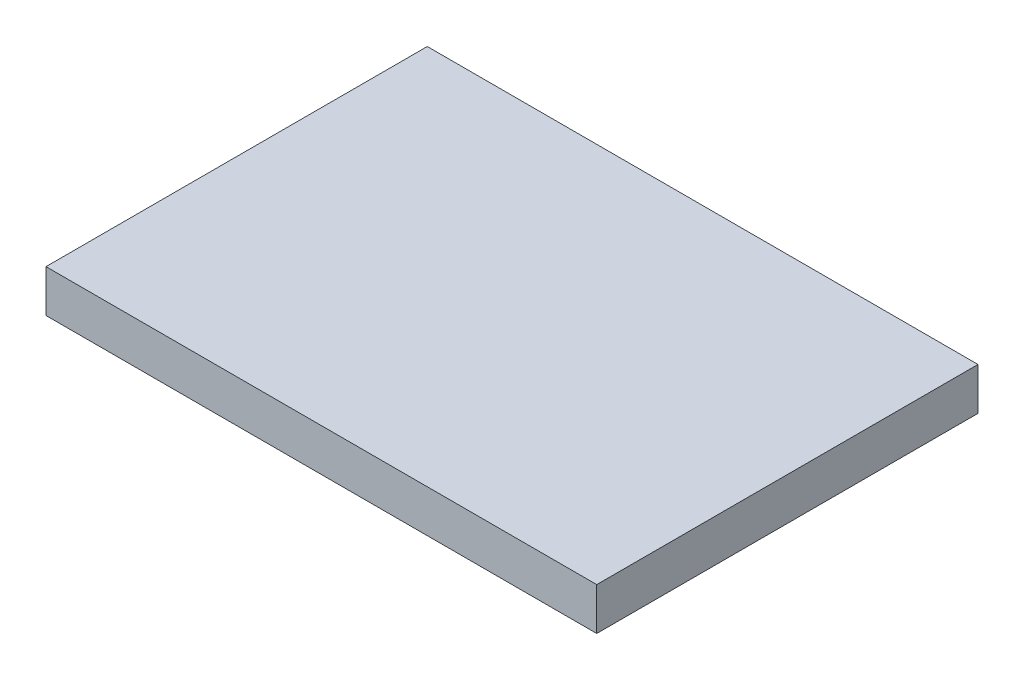
ISO-10303-21;
HEADER;
FILE_DESCRIPTION(('STEP AP214'),'2;1');
FILE_NAME('part.step','',(''),(''),'','','');
FILE_SCHEMA(('AUTOMOTIVE_DESIGN { 1 0 10303 214 1 1 1 1 }'));
ENDSEC;
DATA;
#1=APPLICATION_CONTEXT('core data for automotive mechanical design processes');
#2=APPLICATION_PROTOCOL_DEFINITION('international standard','automotive_design',2000,#1);
#3=PRODUCT_CONTEXT('',#1,'mechanical');
#4=PRODUCT('Part','Part','',(#3));
#5=PRODUCT_RELATED_PRODUCT_CATEGORY('part','',(#4));
#6=PRODUCT_DEFINITION_FORMATION('','',#4);
#7=PRODUCT_DEFINITION_CONTEXT('part definition',#1,'design');
#8=PRODUCT_DEFINITION('design','',#6,#7);
#9=PRODUCT_DEFINITION_SHAPE('','',#8);
#10=(LENGTH_UNIT() NAMED_UNIT(*) SI_UNIT(.MILLI.,.METRE.));
#11=(NAMED_UNIT(*) PLANE_ANGLE_UNIT() SI_UNIT($,.RADIAN.));
#12=(NAMED_UNIT(*) SI_UNIT($,.STERADIAN.) SOLID_ANGLE_UNIT());
#13=UNCERTAINTY_MEASURE_WITH_UNIT(LENGTH_MEASURE(1.E-05),#10,'distance_accuracy_value','');
#14=(GEOMETRIC_REPRESENTATION_CONTEXT(3) GLOBAL_UNCERTAINTY_ASSIGNED_CONTEXT((#13)) GLOBAL_UNIT_ASSIGNED_CONTEXT((#10,
#11,#12)) REPRESENTATION_CONTEXT('',''));
#15=CARTESIAN_POINT('',(0.,0.,0.));
#16=DIRECTION('',(0.,0.,1.));
#17=DIRECTION('',(1.,0.,0.));
#18=AXIS2_PLACEMENT_3D('',#15,#16,#17);
#19=CARTESIAN_POINT('',(0.,50.,0.));
#20=DIRECTION('',(1.,0.,0.));
#21=DIRECTION('',(0.,0.,-1.));
#22=AXIS2_PLACEMENT_3D('',#19,#20,#21);
#23=PLANE('',#22);
#24=DIRECTION('',(0.,0.,1.));
#25=VECTOR('',#24,1.);
#26=CARTESIAN_POINT('',(0.,0.,0.));
#27=LINE('',#26,#25);
#28=CARTESIAN_POINT('',(0.,0.,-450.));
#29=VERTEX_POINT('',#28);
#30=CARTESIAN_POINT('',(0.,0.,0.));
#31=VERTEX_POINT('',#30);
#32=EDGE_CURVE('E111',#29,#31,#27,.T.);
#33=ORIENTED_EDGE('',*,*,#32,.T.);
#34=DIRECTION('',(0.,-1.,0.));
#35=VECTOR('',#34,1.);
#36=CARTESIAN_POINT('',(0.,50.,0.));
#37=LINE('',#36,#35);
#38=CARTESIAN_POINT('',(0.,50.,0.));
#39=VERTEX_POINT('',#38);
#40=EDGE_CURVE('E11',#39,#31,#37,.T.);
#41=ORIENTED_EDGE('',*,*,#40,.F.);
#42=DIRECTION('',(0.,0.,1.));
#43=VECTOR('',#42,1.);
#44=CARTESIAN_POINT('',(0.,50.,0.));
#45=LINE('',#44,#43);
#46=CARTESIAN_POINT('',(0.,50.,-450.));
#47=VERTEX_POINT('',#46);
#48=EDGE_CURVE('E95',#47,#39,#45,.T.);
#49=ORIENTED_EDGE('',*,*,#48,.F.);
#50=DIRECTION('',(0.,-1.,0.));
#51=VECTOR('',#50,1.);
#52=CARTESIAN_POINT('',(0.,50.,-450.));
#53=LINE('',#52,#51);
#54=EDGE_CURVE('E107',#47,#29,#53,.T.);
#55=ORIENTED_EDGE('',*,*,#54,.T.);
#56=EDGE_LOOP('',(#33,#41,#49,#55));
#57=FACE_BOUND('',#56,.T.);
#58=ADVANCED_FACE('F43',(#57),#23,.F.);
#59=CARTESIAN_POINT('',(0.,50.,0.));
#60=DIRECTION('',(0.,0.,-1.));
#61=DIRECTION('',(-1.,0.,0.));
#62=AXIS2_PLACEMENT_3D('',#59,#60,#61);
#63=PLANE('',#62);
#64=DIRECTION('',(1.,0.,0.));
#65=VECTOR('',#64,1.);
#66=CARTESIAN_POINT('',(0.,0.,0.));
#67=LINE('',#66,#65);
#68=CARTESIAN_POINT('',(650.,0.,0.));
#69=VERTEX_POINT('',#68);
#70=EDGE_CURVE('E100',#31,#69,#67,.T.);
#71=ORIENTED_EDGE('',*,*,#70,.T.);
#72=DIRECTION('',(0.,-1.,0.));
#73=VECTOR('',#72,1.);
#74=CARTESIAN_POINT('',(650.,50.,0.));
#75=LINE('',#74,#73);
#76=CARTESIAN_POINT('',(650.,50.,0.));
#77=VERTEX_POINT('',#76);
#78=EDGE_CURVE('E52',#77,#69,#75,.T.);
#79=ORIENTED_EDGE('',*,*,#78,.F.);
#80=DIRECTION('',(1.,0.,0.));
#81=VECTOR('',#80,1.);
#82=CARTESIAN_POINT('',(0.,50.,0.));
#83=LINE('',#82,#81);
#84=EDGE_CURVE('E90',#39,#77,#83,.T.);
#85=ORIENTED_EDGE('',*,*,#84,.F.);
#86=ORIENTED_EDGE('',*,*,#40,.T.);
#87=EDGE_LOOP('',(#71,#79,#85,#86));
#88=FACE_BOUND('',#87,.T.);
#89=ADVANCED_FACE('F99',(#88),#63,.F.);
#90=CARTESIAN_POINT('',(650.,50.,0.));
#91=DIRECTION('',(-1.,0.,0.));
#92=DIRECTION('',(0.,0.,1.));
#93=AXIS2_PLACEMENT_3D('',#90,#91,#92);
#94=PLANE('',#93);
#95=DIRECTION('',(0.,0.,-1.));
#96=VECTOR('',#95,1.);
#97=CARTESIAN_POINT('',(650.,0.,0.));
#98=LINE('',#97,#96);
#99=CARTESIAN_POINT('',(650.,0.,-450.));
#100=VERTEX_POINT('',#99);
#101=EDGE_CURVE('E77',#69,#100,#98,.T.);
#102=ORIENTED_EDGE('',*,*,#101,.T.);
#103=DIRECTION('',(0.,-1.,0.));
#104=VECTOR('',#103,1.);
#105=CARTESIAN_POINT('',(650.,50.,-450.));
#106=LINE('',#105,#104);
#107=CARTESIAN_POINT('',(650.,50.,-450.));
#108=VERTEX_POINT('',#107);
#109=EDGE_CURVE('E102',#108,#100,#106,.T.);
#110=ORIENTED_EDGE('',*,*,#109,.F.);
#111=DIRECTION('',(0.,0.,-1.));
#112=VECTOR('',#111,1.);
#113=CARTESIAN_POINT('',(650.,50.,0.));
#114=LINE('',#113,#112);
#115=EDGE_CURVE('E93',#77,#108,#114,.T.);
#116=ORIENTED_EDGE('',*,*,#115,.F.);
#117=ORIENTED_EDGE('',*,*,#78,.T.);
#118=EDGE_LOOP('',(#102,#110,#116,#117));
#119=FACE_BOUND('',#118,.T.);
#120=ADVANCED_FACE('F103',(#119),#94,.F.);
#121=CARTESIAN_POINT('',(0.,50.,-450.));
#122=DIRECTION('',(0.,0.,1.));
#123=DIRECTION('',(1.,0.,0.));
#124=AXIS2_PLACEMENT_3D('',#121,#122,#123);
#125=PLANE('',#124);
#126=DIRECTION('',(-1.,0.,0.));
#127=VECTOR('',#126,1.);
#128=CARTESIAN_POINT('',(0.,0.,-450.));
#129=LINE('',#128,#127);
#130=EDGE_CURVE('E83',#100,#29,#129,.T.);
#131=ORIENTED_EDGE('',*,*,#130,.T.);
#132=ORIENTED_EDGE('',*,*,#54,.F.);
#133=DIRECTION('',(-1.,0.,0.));
#134=VECTOR('',#133,1.);
#135=CARTESIAN_POINT('',(0.,50.,-450.));
#136=LINE('',#135,#134);
#137=EDGE_CURVE('E60',#108,#47,#136,.T.);
#138=ORIENTED_EDGE('',*,*,#137,.F.);
#139=ORIENTED_EDGE('',*,*,#109,.T.);
#140=EDGE_LOOP('',(#131,#132,#138,#139));
#141=FACE_BOUND('',#140,.T.);
#142=ADVANCED_FACE('F124',(#141),#125,.F.);
#143=CARTESIAN_POINT('',(0.,50.,0.));
#144=DIRECTION('',(0.,-1.,0.));
#145=DIRECTION('',(0.,0.,-1.));
#146=AXIS2_PLACEMENT_3D('',#143,#144,#145);
#147=PLANE('',#146);
#148=ORIENTED_EDGE('',*,*,#48,.T.);
#149=ORIENTED_EDGE('',*,*,#84,.T.);
#150=ORIENTED_EDGE('',*,*,#115,.T.);
#151=ORIENTED_EDGE('',*,*,#137,.T.);
#152=EDGE_LOOP('',(#148,#149,#150,#151));
#153=FACE_BOUND('',#152,.T.);
#154=ADVANCED_FACE('F91',(#153),#147,.F.);
#155=CARTESIAN_POINT('',(0.,0.,0.));
#156=DIRECTION('',(0.,-1.,0.));
#157=DIRECTION('',(0.,0.,-1.));
#158=AXIS2_PLACEMENT_3D('',#155,#156,#157);
#159=PLANE('',#158);
#160=ORIENTED_EDGE('',*,*,#32,.F.);
#161=ORIENTED_EDGE('',*,*,#130,.F.);
#162=ORIENTED_EDGE('',*,*,#101,.F.);
#163=ORIENTED_EDGE('',*,*,#70,.F.);
#164=EDGE_LOOP('',(#160,#161,#162,#163));
#165=FACE_BOUND('',#164,.T.);
#166=ADVANCED_FACE('F127',(#165),#159,.T.);
#167=CLOSED_SHELL('',(#58,#89,#120,#142,#154,#166));
#168=MANIFOLD_SOLID_BREP('B2',#167);
#169=ADVANCED_BREP_SHAPE_REPRESENTATION('',(#18,#168),#14);
#170=SHAPE_DEFINITION_REPRESENTATION(#9,#169);
ENDSEC;
END-ISO-10303-21;
